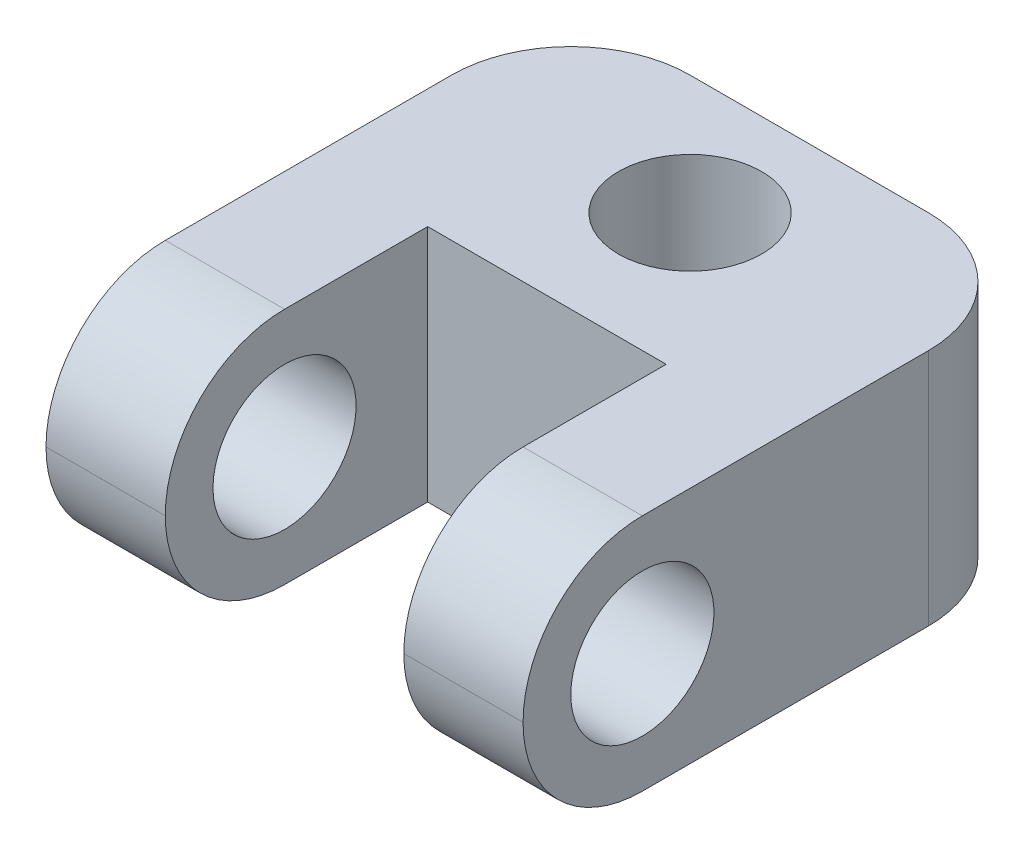
ISO-10303-21;
HEADER;
FILE_DESCRIPTION(('STEP AP214'),'2;1');
FILE_NAME('part.step','',(''),(''),'','','');
FILE_SCHEMA(('AUTOMOTIVE_DESIGN { 1 0 10303 214 1 1 1 1 }'));
ENDSEC;
DATA;
#1=APPLICATION_CONTEXT('core data for automotive mechanical design processes');
#2=APPLICATION_PROTOCOL_DEFINITION('international standard','automotive_design',2000,#1);
#3=PRODUCT_CONTEXT('',#1,'mechanical');
#4=PRODUCT('Part','Part','',(#3));
#5=PRODUCT_RELATED_PRODUCT_CATEGORY('part','',(#4));
#6=PRODUCT_DEFINITION_FORMATION('','',#4);
#7=PRODUCT_DEFINITION_CONTEXT('part definition',#1,'design');
#8=PRODUCT_DEFINITION('design','',#6,#7);
#9=PRODUCT_DEFINITION_SHAPE('','',#8);
#10=(LENGTH_UNIT() NAMED_UNIT(*) SI_UNIT(.MILLI.,.METRE.));
#11=(NAMED_UNIT(*) PLANE_ANGLE_UNIT() SI_UNIT($,.RADIAN.));
#12=(NAMED_UNIT(*) SI_UNIT($,.STERADIAN.) SOLID_ANGLE_UNIT());
#13=UNCERTAINTY_MEASURE_WITH_UNIT(LENGTH_MEASURE(1.E-05),#10,'distance_accuracy_value','');
#14=(GEOMETRIC_REPRESENTATION_CONTEXT(3) GLOBAL_UNCERTAINTY_ASSIGNED_CONTEXT((#13)) GLOBAL_UNIT_ASSIGNED_CONTEXT((#10,
#11,#12)) REPRESENTATION_CONTEXT('',''));
#15=CARTESIAN_POINT('',(0.,0.,0.));
#16=DIRECTION('',(0.,0.,1.));
#17=DIRECTION('',(1.,0.,0.));
#18=AXIS2_PLACEMENT_3D('',#15,#16,#17);
#19=CARTESIAN_POINT('',(5.,5.,-5.5));
#20=DIRECTION('',(-1.,0.,0.));
#21=DIRECTION('',(0.,0.,1.));
#22=AXIS2_PLACEMENT_3D('',#19,#20,#21);
#23=PLANE('',#22);
#24=CARTESIAN_POINT('',(5.,2.5,3.));
#25=DIRECTION('',(-1.,0.,0.));
#26=DIRECTION('',(0.,0.,1.));
#27=AXIS2_PLACEMENT_3D('',#24,#25,#26);
#28=CIRCLE('',#27,1.5);
#29=CARTESIAN_POINT('',(5.,2.5,4.5));
#30=VERTEX_POINT('',#29);
#31=EDGE_CURVE('E181',#30,#30,#28,.T.);
#32=ORIENTED_EDGE('',*,*,#31,.T.);
#33=EDGE_LOOP('',(#32));
#34=FACE_BOUND('',#33,.T.);
#35=DIRECTION('',(0.,0.,-1.));
#36=VECTOR('',#35,1.);
#37=CARTESIAN_POINT('',(5.,0.,-5.5));
#38=LINE('',#37,#36);
#39=CARTESIAN_POINT('',(5.,0.,3.));
#40=VERTEX_POINT('',#39);
#41=CARTESIAN_POINT('',(5.,0.,-3.));
#42=VERTEX_POINT('',#41);
#43=EDGE_CURVE('E162',#40,#42,#38,.T.);
#44=ORIENTED_EDGE('',*,*,#43,.T.);
#45=DIRECTION('',(0.,-1.,0.));
#46=VECTOR('',#45,1.);
#47=CARTESIAN_POINT('',(5.,5.,-3.));
#48=LINE('',#47,#46);
#49=CARTESIAN_POINT('',(5.,5.,-3.));
#50=VERTEX_POINT('',#49);
#51=EDGE_CURVE('E56',#42,#50,#48,.F.);
#52=ORIENTED_EDGE('',*,*,#51,.T.);
#53=DIRECTION('',(0.,0.,-1.));
#54=VECTOR('',#53,1.);
#55=CARTESIAN_POINT('',(5.,5.,-5.5));
#56=LINE('',#55,#54);
#57=CARTESIAN_POINT('',(5.,5.,3.));
#58=VERTEX_POINT('',#57);
#59=EDGE_CURVE('E164',#58,#50,#56,.T.);
#60=ORIENTED_EDGE('',*,*,#59,.F.);
#61=CARTESIAN_POINT('',(5.,2.5,3.));
#62=DIRECTION('',(-1.,0.,0.));
#63=DIRECTION('',(0.,0.,1.));
#64=AXIS2_PLACEMENT_3D('',#61,#62,#63);
#65=CIRCLE('',#64,2.5);
#66=CARTESIAN_POINT('',(5.,2.5,5.5));
#67=VERTEX_POINT('',#66);
#68=EDGE_CURVE('E171',#58,#67,#65,.F.);
#69=ORIENTED_EDGE('',*,*,#68,.T.);
#70=CARTESIAN_POINT('',(5.,2.5,3.));
#71=DIRECTION('',(-1.,0.,0.));
#72=DIRECTION('',(0.,0.,1.));
#73=AXIS2_PLACEMENT_3D('',#70,#71,#72);
#74=CIRCLE('',#73,2.5);
#75=EDGE_CURVE('E183',#67,#40,#74,.F.);
#76=ORIENTED_EDGE('',*,*,#75,.T.);
#77=EDGE_LOOP('',(#44,#52,#60,#69,#76));
#78=FACE_BOUND('',#77,.T.);
#79=ADVANCED_FACE('F33',(#34,#78),#23,.F.);
#80=CARTESIAN_POINT('',(-5.,5.,-5.5));
#81=DIRECTION('',(0.,0.,1.));
#82=DIRECTION('',(1.,0.,0.));
#83=AXIS2_PLACEMENT_3D('',#80,#81,#82);
#84=PLANE('',#83);
#85=DIRECTION('',(-1.,0.,0.));
#86=VECTOR('',#85,1.);
#87=CARTESIAN_POINT('',(-5.,5.,-5.5));
#88=LINE('',#87,#86);
#89=CARTESIAN_POINT('',(2.5,5.,-5.5));
#90=VERTEX_POINT('',#89);
#91=CARTESIAN_POINT('',(-2.5,5.,-5.5));
#92=VERTEX_POINT('',#91);
#93=EDGE_CURVE('E166',#90,#92,#88,.T.);
#94=ORIENTED_EDGE('',*,*,#93,.F.);
#95=DIRECTION('',(0.,-1.,0.));
#96=VECTOR('',#95,1.);
#97=CARTESIAN_POINT('',(2.5,5.,-5.5));
#98=LINE('',#97,#96);
#99=CARTESIAN_POINT('',(2.5,0.,-5.5));
#100=VERTEX_POINT('',#99);
#101=EDGE_CURVE('E215',#90,#100,#98,.T.);
#102=ORIENTED_EDGE('',*,*,#101,.T.);
#103=DIRECTION('',(-1.,0.,0.));
#104=VECTOR('',#103,1.);
#105=CARTESIAN_POINT('',(-5.,0.,-5.5));
#106=LINE('',#105,#104);
#107=CARTESIAN_POINT('',(-2.5,0.,-5.5));
#108=VERTEX_POINT('',#107);
#109=EDGE_CURVE('E173',#100,#108,#106,.T.);
#110=ORIENTED_EDGE('',*,*,#109,.T.);
#111=DIRECTION('',(0.,-1.,0.));
#112=VECTOR('',#111,1.);
#113=CARTESIAN_POINT('',(-2.5,5.,-5.5));
#114=LINE('',#113,#112);
#115=EDGE_CURVE('E206',#108,#92,#114,.F.);
#116=ORIENTED_EDGE('',*,*,#115,.T.);
#117=EDGE_LOOP('',(#94,#102,#110,#116));
#118=FACE_BOUND('',#117,.T.);
#119=ADVANCED_FACE('F229',(#118),#84,.F.);
#120=CARTESIAN_POINT('',(-5.,5.,-5.5));
#121=DIRECTION('',(1.,0.,0.));
#122=DIRECTION('',(0.,0.,-1.));
#123=AXIS2_PLACEMENT_3D('',#120,#121,#122);
#124=PLANE('',#123);
#125=CARTESIAN_POINT('',(-5.,2.5,3.));
#126=DIRECTION('',(-1.,0.,0.));
#127=DIRECTION('',(0.,0.,1.));
#128=AXIS2_PLACEMENT_3D('',#125,#126,#127);
#129=CIRCLE('',#128,1.5);
#130=CARTESIAN_POINT('',(-5.,2.5,4.5));
#131=VERTEX_POINT('',#130);
#132=EDGE_CURVE('E210',#131,#131,#129,.T.);
#133=ORIENTED_EDGE('',*,*,#132,.F.);
#134=EDGE_LOOP('',(#133));
#135=FACE_BOUND('',#134,.T.);
#136=DIRECTION('',(0.,0.,1.));
#137=VECTOR('',#136,1.);
#138=CARTESIAN_POINT('',(-5.,5.,-5.5));
#139=LINE('',#138,#137);
#140=CARTESIAN_POINT('',(-5.,5.,-3.));
#141=VERTEX_POINT('',#140);
#142=CARTESIAN_POINT('',(-5.,5.,3.));
#143=VERTEX_POINT('',#142);
#144=EDGE_CURVE('E169',#141,#143,#139,.T.);
#145=ORIENTED_EDGE('',*,*,#144,.F.);
#146=DIRECTION('',(0.,-1.,0.));
#147=VECTOR('',#146,1.);
#148=CARTESIAN_POINT('',(-5.,5.,-3.));
#149=LINE('',#148,#147);
#150=CARTESIAN_POINT('',(-5.,0.,-3.));
#151=VERTEX_POINT('',#150);
#152=EDGE_CURVE('E11',#141,#151,#149,.T.);
#153=ORIENTED_EDGE('',*,*,#152,.T.);
#154=DIRECTION('',(0.,0.,1.));
#155=VECTOR('',#154,1.);
#156=CARTESIAN_POINT('',(-5.,0.,-5.5));
#157=LINE('',#156,#155);
#158=CARTESIAN_POINT('',(-5.,0.,3.));
#159=VERTEX_POINT('',#158);
#160=EDGE_CURVE('E167',#151,#159,#157,.T.);
#161=ORIENTED_EDGE('',*,*,#160,.T.);
#162=CARTESIAN_POINT('',(-5.,2.5,3.));
#163=DIRECTION('',(1.,0.,0.));
#164=DIRECTION('',(0.,0.,-1.));
#165=AXIS2_PLACEMENT_3D('',#162,#163,#164);
#166=CIRCLE('',#165,2.5);
#167=CARTESIAN_POINT('',(-5.,2.5,5.5));
#168=VERTEX_POINT('',#167);
#169=EDGE_CURVE('E204',#159,#168,#166,.F.);
#170=ORIENTED_EDGE('',*,*,#169,.T.);
#171=CARTESIAN_POINT('',(-5.,2.5,3.));
#172=DIRECTION('',(1.,0.,0.));
#173=DIRECTION('',(0.,0.,-1.));
#174=AXIS2_PLACEMENT_3D('',#171,#172,#173);
#175=CIRCLE('',#174,2.5);
#176=EDGE_CURVE('E201',#168,#143,#175,.F.);
#177=ORIENTED_EDGE('',*,*,#176,.T.);
#178=EDGE_LOOP('',(#145,#153,#161,#170,#177));
#179=FACE_BOUND('',#178,.T.);
#180=ADVANCED_FACE('F257',(#135,#179),#124,.F.);
#181=CARTESIAN_POINT('',(0.,5.,0.));
#182=DIRECTION('',(0.,1.,0.));
#183=DIRECTION('',(0.,0.,1.));
#184=AXIS2_PLACEMENT_3D('',#181,#182,#183);
#185=PLANE('',#184);
#186=CARTESIAN_POINT('',(0.,5.,-3.));
#187=DIRECTION('',(0.,1.,0.));
#188=DIRECTION('',(0.,0.,1.));
#189=AXIS2_PLACEMENT_3D('',#186,#187,#188);
#190=CIRCLE('',#189,1.5);
#191=CARTESIAN_POINT('',(0.,5.,-1.5));
#192=VERTEX_POINT('',#191);
#193=EDGE_CURVE('E364',#192,#192,#190,.T.);
#194=ORIENTED_EDGE('',*,*,#193,.F.);
#195=EDGE_LOOP('',(#194));
#196=FACE_BOUND('',#195,.T.);
#197=ORIENTED_EDGE('',*,*,#59,.T.);
#198=CARTESIAN_POINT('',(2.5,5.,-3.));
#199=DIRECTION('',(0.,1.,0.));
#200=DIRECTION('',(0.,0.,1.));
#201=AXIS2_PLACEMENT_3D('',#198,#199,#200);
#202=CIRCLE('',#201,2.5);
#203=EDGE_CURVE('E41',#50,#90,#202,.T.);
#204=ORIENTED_EDGE('',*,*,#203,.T.);
#205=ORIENTED_EDGE('',*,*,#93,.T.);
#206=CARTESIAN_POINT('',(-2.5,5.,-3.));
#207=DIRECTION('',(0.,1.,0.));
#208=DIRECTION('',(0.,0.,1.));
#209=AXIS2_PLACEMENT_3D('',#206,#207,#208);
#210=CIRCLE('',#209,2.5);
#211=EDGE_CURVE('E48',#92,#141,#210,.T.);
#212=ORIENTED_EDGE('',*,*,#211,.T.);
#213=ORIENTED_EDGE('',*,*,#144,.T.);
#214=DIRECTION('',(1.,0.,0.));
#215=VECTOR('',#214,1.);
#216=CARTESIAN_POINT('',(-2.5,5.,3.));
#217=LINE('',#216,#215);
#218=CARTESIAN_POINT('',(-2.5,5.,3.));
#219=VERTEX_POINT('',#218);
#220=EDGE_CURVE('E193',#143,#219,#217,.T.);
#221=ORIENTED_EDGE('',*,*,#220,.T.);
#222=DIRECTION('',(0.,0.,1.));
#223=VECTOR('',#222,1.);
#224=CARTESIAN_POINT('',(-2.5,5.,0.));
#225=LINE('',#224,#223);
#226=CARTESIAN_POINT('',(-2.5,5.,0.));
#227=VERTEX_POINT('',#226);
#228=EDGE_CURVE('E137',#227,#219,#225,.T.);
#229=ORIENTED_EDGE('',*,*,#228,.F.);
#230=DIRECTION('',(-1.,0.,0.));
#231=VECTOR('',#230,1.);
#232=CARTESIAN_POINT('',(-2.5,5.,0.));
#233=LINE('',#232,#231);
#234=CARTESIAN_POINT('',(2.5,5.,0.));
#235=VERTEX_POINT('',#234);
#236=EDGE_CURVE('E157',#235,#227,#233,.T.);
#237=ORIENTED_EDGE('',*,*,#236,.F.);
#238=DIRECTION('',(0.,0.,-1.));
#239=VECTOR('',#238,1.);
#240=CARTESIAN_POINT('',(2.5,5.,0.));
#241=LINE('',#240,#239);
#242=CARTESIAN_POINT('',(2.5,5.,3.));
#243=VERTEX_POINT('',#242);
#244=EDGE_CURVE('E143',#243,#235,#241,.T.);
#245=ORIENTED_EDGE('',*,*,#244,.F.);
#246=DIRECTION('',(1.,0.,0.));
#247=VECTOR('',#246,1.);
#248=CARTESIAN_POINT('',(5.,5.,3.));
#249=LINE('',#248,#247);
#250=EDGE_CURVE('E195',#243,#58,#249,.T.);
#251=ORIENTED_EDGE('',*,*,#250,.T.);
#252=EDGE_LOOP('',(#197,#204,#205,#212,#213,#221,#229,#237,#245,#251));
#253=FACE_BOUND('',#252,.T.);
#254=ADVANCED_FACE('F225',(#196,#253),#185,.T.);
#255=CARTESIAN_POINT('',(0.,0.,0.));
#256=DIRECTION('',(0.,1.,0.));
#257=DIRECTION('',(0.,0.,1.));
#258=AXIS2_PLACEMENT_3D('',#255,#256,#257);
#259=PLANE('',#258);
#260=CARTESIAN_POINT('',(0.,0.,-3.));
#261=DIRECTION('',(0.,1.,0.));
#262=DIRECTION('',(0.,0.,1.));
#263=AXIS2_PLACEMENT_3D('',#260,#261,#262);
#264=CIRCLE('',#263,1.5);
#265=CARTESIAN_POINT('',(0.,0.,-1.5));
#266=VERTEX_POINT('',#265);
#267=EDGE_CURVE('E158',#266,#266,#264,.T.);
#268=ORIENTED_EDGE('',*,*,#267,.T.);
#269=EDGE_LOOP('',(#268));
#270=FACE_BOUND('',#269,.T.);
#271=ORIENTED_EDGE('',*,*,#109,.F.);
#272=CARTESIAN_POINT('',(2.5,0.,-3.));
#273=DIRECTION('',(0.,1.,0.));
#274=DIRECTION('',(0.,0.,1.));
#275=AXIS2_PLACEMENT_3D('',#272,#273,#274);
#276=CIRCLE('',#275,2.5);
#277=EDGE_CURVE('E220',#100,#42,#276,.F.);
#278=ORIENTED_EDGE('',*,*,#277,.T.);
#279=ORIENTED_EDGE('',*,*,#43,.F.);
#280=DIRECTION('',(1.,0.,0.));
#281=VECTOR('',#280,1.);
#282=CARTESIAN_POINT('',(0.,0.,3.));
#283=LINE('',#282,#281);
#284=CARTESIAN_POINT('',(2.5,0.,3.));
#285=VERTEX_POINT('',#284);
#286=EDGE_CURVE('E135',#40,#285,#283,.F.);
#287=ORIENTED_EDGE('',*,*,#286,.T.);
#288=DIRECTION('',(0.,0.,-1.));
#289=VECTOR('',#288,1.);
#290=CARTESIAN_POINT('',(2.5,0.,0.));
#291=LINE('',#290,#289);
#292=CARTESIAN_POINT('',(2.5,0.,0.));
#293=VERTEX_POINT('',#292);
#294=EDGE_CURVE('E126',#285,#293,#291,.T.);
#295=ORIENTED_EDGE('',*,*,#294,.T.);
#296=DIRECTION('',(-1.,0.,0.));
#297=VECTOR('',#296,1.);
#298=CARTESIAN_POINT('',(-2.5,0.,0.));
#299=LINE('',#298,#297);
#300=CARTESIAN_POINT('',(-2.5,0.,0.));
#301=VERTEX_POINT('',#300);
#302=EDGE_CURVE('E132',#293,#301,#299,.T.);
#303=ORIENTED_EDGE('',*,*,#302,.T.);
#304=DIRECTION('',(0.,0.,1.));
#305=VECTOR('',#304,1.);
#306=CARTESIAN_POINT('',(-2.5,0.,0.));
#307=LINE('',#306,#305);
#308=CARTESIAN_POINT('',(-2.5,0.,3.));
#309=VERTEX_POINT('',#308);
#310=EDGE_CURVE('E148',#301,#309,#307,.T.);
#311=ORIENTED_EDGE('',*,*,#310,.T.);
#312=DIRECTION('',(1.,0.,0.));
#313=VECTOR('',#312,1.);
#314=CARTESIAN_POINT('',(0.,0.,3.));
#315=LINE('',#314,#313);
#316=EDGE_CURVE('E185',#309,#159,#315,.F.);
#317=ORIENTED_EDGE('',*,*,#316,.T.);
#318=ORIENTED_EDGE('',*,*,#160,.F.);
#319=CARTESIAN_POINT('',(-2.5,0.,-3.));
#320=DIRECTION('',(0.,1.,0.));
#321=DIRECTION('',(0.,0.,1.));
#322=AXIS2_PLACEMENT_3D('',#319,#320,#321);
#323=CIRCLE('',#322,2.5);
#324=EDGE_CURVE('E218',#151,#108,#323,.F.);
#325=ORIENTED_EDGE('',*,*,#324,.T.);
#326=EDGE_LOOP('',(#271,#278,#279,#287,#295,#303,#311,#317,#318,#325));
#327=FACE_BOUND('',#326,.T.);
#328=ADVANCED_FACE('F129',(#270,#327),#259,.F.);
#329=CARTESIAN_POINT('',(2.5,0.,0.));
#330=DIRECTION('',(1.,0.,0.));
#331=DIRECTION('',(0.,0.,-1.));
#332=AXIS2_PLACEMENT_3D('',#329,#330,#331);
#333=PLANE('',#332);
#334=CARTESIAN_POINT('',(2.5,2.5,3.));
#335=DIRECTION('',(1.,0.,0.));
#336=DIRECTION('',(0.,0.,-1.));
#337=AXIS2_PLACEMENT_3D('',#334,#335,#336);
#338=CIRCLE('',#337,1.5);
#339=CARTESIAN_POINT('',(2.5,2.5,1.5));
#340=VERTEX_POINT('',#339);
#341=EDGE_CURVE('E180',#340,#340,#338,.T.);
#342=ORIENTED_EDGE('',*,*,#341,.T.);
#343=EDGE_LOOP('',(#342));
#344=FACE_BOUND('',#343,.T.);
#345=ORIENTED_EDGE('',*,*,#294,.F.);
#346=CARTESIAN_POINT('',(2.5,2.5,3.));
#347=DIRECTION('',(1.,0.,0.));
#348=DIRECTION('',(0.,0.,-1.));
#349=AXIS2_PLACEMENT_3D('',#346,#347,#348);
#350=CIRCLE('',#349,2.5);
#351=CARTESIAN_POINT('',(2.5,2.5,5.5));
#352=VERTEX_POINT('',#351);
#353=EDGE_CURVE('E191',#285,#352,#350,.F.);
#354=ORIENTED_EDGE('',*,*,#353,.T.);
#355=CARTESIAN_POINT('',(2.5,2.5,3.));
#356=DIRECTION('',(1.,0.,0.));
#357=DIRECTION('',(0.,0.,-1.));
#358=AXIS2_PLACEMENT_3D('',#355,#356,#357);
#359=CIRCLE('',#358,2.5);
#360=EDGE_CURVE('E189',#352,#243,#359,.F.);
#361=ORIENTED_EDGE('',*,*,#360,.T.);
#362=ORIENTED_EDGE('',*,*,#244,.T.);
#363=DIRECTION('',(0.,1.,0.));
#364=VECTOR('',#363,1.);
#365=CARTESIAN_POINT('',(2.5,0.,0.));
#366=LINE('',#365,#364);
#367=EDGE_CURVE('E140',#293,#235,#366,.T.);
#368=ORIENTED_EDGE('',*,*,#367,.F.);
#369=EDGE_LOOP('',(#345,#354,#361,#362,#368));
#370=FACE_BOUND('',#369,.T.);
#371=ADVANCED_FACE('F141',(#344,#370),#333,.F.);
#372=CARTESIAN_POINT('',(-2.5,0.,0.));
#373=DIRECTION('',(-1.,0.,0.));
#374=DIRECTION('',(0.,0.,1.));
#375=AXIS2_PLACEMENT_3D('',#372,#373,#374);
#376=PLANE('',#375);
#377=CARTESIAN_POINT('',(-2.5,2.5,3.));
#378=DIRECTION('',(-1.,0.,0.));
#379=DIRECTION('',(0.,0.,1.));
#380=AXIS2_PLACEMENT_3D('',#377,#378,#379);
#381=CIRCLE('',#380,1.5);
#382=CARTESIAN_POINT('',(-2.5,2.5,4.5));
#383=VERTEX_POINT('',#382);
#384=EDGE_CURVE('E177',#383,#383,#381,.T.);
#385=ORIENTED_EDGE('',*,*,#384,.T.);
#386=EDGE_LOOP('',(#385));
#387=FACE_BOUND('',#386,.T.);
#388=CARTESIAN_POINT('',(-2.5,2.5,3.));
#389=DIRECTION('',(-1.,0.,0.));
#390=DIRECTION('',(0.,0.,1.));
#391=AXIS2_PLACEMENT_3D('',#388,#389,#390);
#392=CIRCLE('',#391,2.5);
#393=CARTESIAN_POINT('',(-2.5,2.5,5.5));
#394=VERTEX_POINT('',#393);
#395=EDGE_CURVE('E197',#219,#394,#392,.F.);
#396=ORIENTED_EDGE('',*,*,#395,.T.);
#397=CARTESIAN_POINT('',(-2.5,2.5,3.));
#398=DIRECTION('',(-1.,0.,0.));
#399=DIRECTION('',(0.,0.,1.));
#400=AXIS2_PLACEMENT_3D('',#397,#398,#399);
#401=CIRCLE('',#400,2.5);
#402=EDGE_CURVE('E199',#394,#309,#401,.F.);
#403=ORIENTED_EDGE('',*,*,#402,.T.);
#404=ORIENTED_EDGE('',*,*,#310,.F.);
#405=DIRECTION('',(0.,1.,0.));
#406=VECTOR('',#405,1.);
#407=CARTESIAN_POINT('',(-2.5,0.,0.));
#408=LINE('',#407,#406);
#409=EDGE_CURVE('E147',#301,#227,#408,.T.);
#410=ORIENTED_EDGE('',*,*,#409,.T.);
#411=ORIENTED_EDGE('',*,*,#228,.T.);
#412=EDGE_LOOP('',(#396,#403,#404,#410,#411));
#413=FACE_BOUND('',#412,.T.);
#414=ADVANCED_FACE('F245',(#387,#413),#376,.F.);
#415=CARTESIAN_POINT('',(-2.5,0.,0.));
#416=DIRECTION('',(0.,0.,-1.));
#417=DIRECTION('',(-1.,0.,0.));
#418=AXIS2_PLACEMENT_3D('',#415,#416,#417);
#419=PLANE('',#418);
#420=ORIENTED_EDGE('',*,*,#236,.T.);
#421=ORIENTED_EDGE('',*,*,#409,.F.);
#422=ORIENTED_EDGE('',*,*,#302,.F.);
#423=ORIENTED_EDGE('',*,*,#367,.T.);
#424=EDGE_LOOP('',(#420,#421,#422,#423));
#425=FACE_BOUND('',#424,.T.);
#426=ADVANCED_FACE('F151',(#425),#419,.F.);
#427=CARTESIAN_POINT('',(0.,0.,-3.));
#428=DIRECTION('',(0.,1.,0.));
#429=DIRECTION('',(0.,0.,1.));
#430=AXIS2_PLACEMENT_3D('',#427,#428,#429);
#431=CYLINDRICAL_SURFACE('',#430,1.5);
#432=ORIENTED_EDGE('',*,*,#267,.F.);
#433=EDGE_LOOP('',(#432));
#434=FACE_BOUND('',#433,.T.);
#435=ORIENTED_EDGE('',*,*,#193,.T.);
#436=EDGE_LOOP('',(#435));
#437=FACE_BOUND('',#436,.T.);
#438=ADVANCED_FACE('F346',(#434,#437),#431,.F.);
#439=CARTESIAN_POINT('',(5.,2.5,3.));
#440=DIRECTION('',(-1.,0.,0.));
#441=DIRECTION('',(0.,0.,1.));
#442=AXIS2_PLACEMENT_3D('',#439,#440,#441);
#443=CYLINDRICAL_SURFACE('',#442,1.5);
#444=ORIENTED_EDGE('',*,*,#132,.T.);
#445=EDGE_LOOP('',(#444));
#446=FACE_BOUND('',#445,.T.);
#447=ORIENTED_EDGE('',*,*,#384,.F.);
#448=EDGE_LOOP('',(#447));
#449=FACE_BOUND('',#448,.T.);
#450=ADVANCED_FACE('F352',(#446,#449),#443,.F.);
#451=ORIENTED_EDGE('',*,*,#31,.F.);
#452=EDGE_LOOP('',(#451));
#453=FACE_BOUND('',#452,.T.);
#454=ORIENTED_EDGE('',*,*,#341,.F.);
#455=EDGE_LOOP('',(#454));
#456=FACE_BOUND('',#455,.T.);
#457=ADVANCED_FACE('F278',(#453,#456),#443,.F.);
#458=CARTESIAN_POINT('',(0.,2.5,3.));
#459=DIRECTION('',(-1.,0.,0.));
#460=DIRECTION('',(0.,0.,1.));
#461=AXIS2_PLACEMENT_3D('',#458,#459,#460);
#462=CYLINDRICAL_SURFACE('',#461,2.5);
#463=ORIENTED_EDGE('',*,*,#250,.F.);
#464=ORIENTED_EDGE('',*,*,#360,.F.);
#465=DIRECTION('',(1.,0.,0.));
#466=VECTOR('',#465,1.);
#467=CARTESIAN_POINT('',(2.5,2.5,5.5));
#468=LINE('',#467,#466);
#469=EDGE_CURVE('E207',#67,#352,#468,.F.);
#470=ORIENTED_EDGE('',*,*,#469,.F.);
#471=ORIENTED_EDGE('',*,*,#68,.F.);
#472=EDGE_LOOP('',(#463,#464,#470,#471));
#473=FACE_BOUND('',#472,.T.);
#474=ADVANCED_FACE('F240',(#473),#462,.T.);
#475=CARTESIAN_POINT('',(-5.,2.5,3.));
#476=DIRECTION('',(1.,0.,0.));
#477=DIRECTION('',(0.,0.,-1.));
#478=AXIS2_PLACEMENT_3D('',#475,#476,#477);
#479=CYLINDRICAL_SURFACE('',#478,2.5);
#480=ORIENTED_EDGE('',*,*,#353,.F.);
#481=ORIENTED_EDGE('',*,*,#286,.F.);
#482=ORIENTED_EDGE('',*,*,#75,.F.);
#483=ORIENTED_EDGE('',*,*,#469,.T.);
#484=EDGE_LOOP('',(#480,#481,#482,#483));
#485=FACE_BOUND('',#484,.T.);
#486=ADVANCED_FACE('F236',(#485),#479,.T.);
#487=CARTESIAN_POINT('',(0.,2.5,3.));
#488=DIRECTION('',(-1.,0.,0.));
#489=DIRECTION('',(0.,0.,1.));
#490=AXIS2_PLACEMENT_3D('',#487,#488,#489);
#491=CYLINDRICAL_SURFACE('',#490,2.5);
#492=ORIENTED_EDGE('',*,*,#220,.F.);
#493=ORIENTED_EDGE('',*,*,#176,.F.);
#494=DIRECTION('',(1.,0.,0.));
#495=VECTOR('',#494,1.);
#496=CARTESIAN_POINT('',(-5.,2.5,5.5));
#497=LINE('',#496,#495);
#498=EDGE_CURVE('E211',#394,#168,#497,.F.);
#499=ORIENTED_EDGE('',*,*,#498,.F.);
#500=ORIENTED_EDGE('',*,*,#395,.F.);
#501=EDGE_LOOP('',(#492,#493,#499,#500));
#502=FACE_BOUND('',#501,.T.);
#503=ADVANCED_FACE('F248',(#502),#491,.T.);
#504=CARTESIAN_POINT('',(-5.,2.5,3.));
#505=DIRECTION('',(1.,0.,0.));
#506=DIRECTION('',(0.,0.,-1.));
#507=AXIS2_PLACEMENT_3D('',#504,#505,#506);
#508=CYLINDRICAL_SURFACE('',#507,2.5);
#509=ORIENTED_EDGE('',*,*,#169,.F.);
#510=ORIENTED_EDGE('',*,*,#316,.F.);
#511=ORIENTED_EDGE('',*,*,#402,.F.);
#512=ORIENTED_EDGE('',*,*,#498,.T.);
#513=EDGE_LOOP('',(#509,#510,#511,#512));
#514=FACE_BOUND('',#513,.T.);
#515=ADVANCED_FACE('F254',(#514),#508,.T.);
#516=CARTESIAN_POINT('',(2.5,5.,-3.));
#517=DIRECTION('',(0.,-1.,0.));
#518=DIRECTION('',(0.,0.,-1.));
#519=AXIS2_PLACEMENT_3D('',#516,#517,#518);
#520=CYLINDRICAL_SURFACE('',#519,2.5);
#521=ORIENTED_EDGE('',*,*,#203,.F.);
#522=ORIENTED_EDGE('',*,*,#51,.F.);
#523=ORIENTED_EDGE('',*,*,#277,.F.);
#524=ORIENTED_EDGE('',*,*,#101,.F.);
#525=EDGE_LOOP('',(#521,#522,#523,#524));
#526=FACE_BOUND('',#525,.T.);
#527=ADVANCED_FACE('F231',(#526),#520,.T.);
#528=CARTESIAN_POINT('',(-2.5,5.,-3.));
#529=DIRECTION('',(0.,-1.,0.));
#530=DIRECTION('',(0.,0.,-1.));
#531=AXIS2_PLACEMENT_3D('',#528,#529,#530);
#532=CYLINDRICAL_SURFACE('',#531,2.5);
#533=ORIENTED_EDGE('',*,*,#211,.F.);
#534=ORIENTED_EDGE('',*,*,#115,.F.);
#535=ORIENTED_EDGE('',*,*,#324,.F.);
#536=ORIENTED_EDGE('',*,*,#152,.F.);
#537=EDGE_LOOP('',(#533,#534,#535,#536));
#538=FACE_BOUND('',#537,.T.);
#539=ADVANCED_FACE('F35',(#538),#532,.T.);
#540=CLOSED_SHELL('',(#79,#119,#180,#254,#328,#371,#414,#426,#438,#450,#457,#474,#486,#503,#515,
#527,#539));
#541=MANIFOLD_SOLID_BREP('B2',#540);
#542=ADVANCED_BREP_SHAPE_REPRESENTATION('',(#18,#541),#14);
#543=SHAPE_DEFINITION_REPRESENTATION(#9,#542);
ENDSEC;
END-ISO-10303-21;
